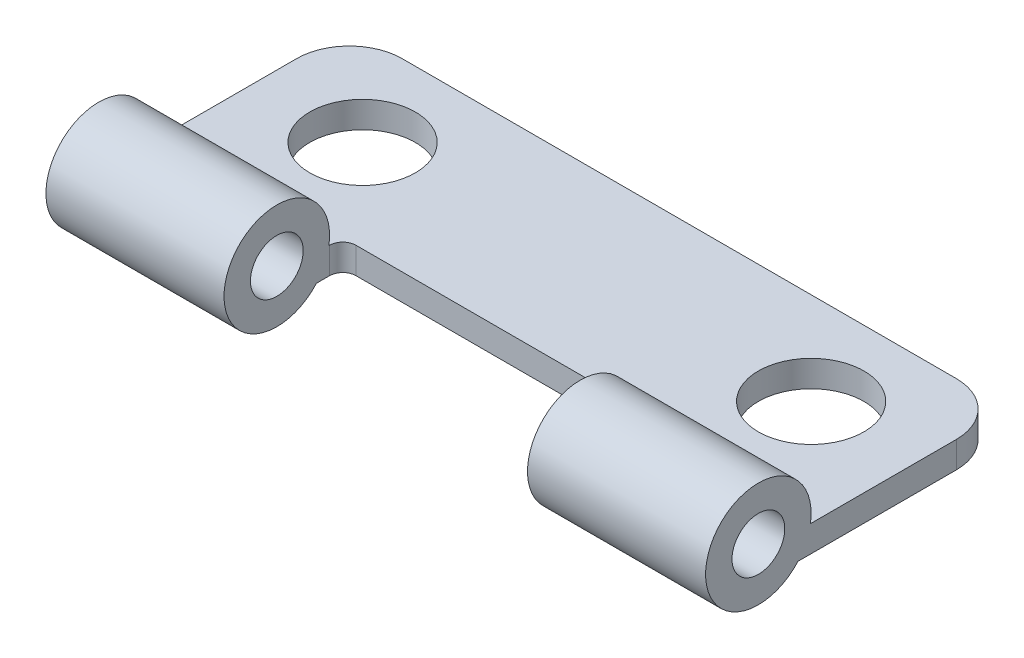
ISO-10303-21;
HEADER;
FILE_DESCRIPTION(('STEP AP214'),'2;1');
FILE_NAME('part.step','',(''),(''),'','','');
FILE_SCHEMA(('AUTOMOTIVE_DESIGN { 1 0 10303 214 1 1 1 1 }'));
ENDSEC;
DATA;
#1=APPLICATION_CONTEXT('core data for automotive mechanical design processes');
#2=APPLICATION_PROTOCOL_DEFINITION('international standard','automotive_design',2000,#1);
#3=PRODUCT_CONTEXT('',#1,'mechanical');
#4=PRODUCT('Part','Part','',(#3));
#5=PRODUCT_RELATED_PRODUCT_CATEGORY('part','',(#4));
#6=PRODUCT_DEFINITION_FORMATION('','',#4);
#7=PRODUCT_DEFINITION_CONTEXT('part definition',#1,'design');
#8=PRODUCT_DEFINITION('design','',#6,#7);
#9=PRODUCT_DEFINITION_SHAPE('','',#8);
#10=(LENGTH_UNIT() NAMED_UNIT(*) SI_UNIT(.MILLI.,.METRE.));
#11=(NAMED_UNIT(*) PLANE_ANGLE_UNIT() SI_UNIT($,.RADIAN.));
#12=(NAMED_UNIT(*) SI_UNIT($,.STERADIAN.) SOLID_ANGLE_UNIT());
#13=UNCERTAINTY_MEASURE_WITH_UNIT(LENGTH_MEASURE(1.E-05),#10,'distance_accuracy_value','');
#14=(GEOMETRIC_REPRESENTATION_CONTEXT(3) GLOBAL_UNCERTAINTY_ASSIGNED_CONTEXT((#13)) GLOBAL_UNIT_ASSIGNED_CONTEXT((#10,
#11,#12)) REPRESENTATION_CONTEXT('',''));
#15=CARTESIAN_POINT('',(0.,0.,0.));
#16=DIRECTION('',(0.,0.,1.));
#17=DIRECTION('',(1.,0.,0.));
#18=AXIS2_PLACEMENT_3D('',#15,#16,#17);
#19=CARTESIAN_POINT('',(0.,1.,0.));
#20=DIRECTION('',(0.,1.,0.));
#21=DIRECTION('',(0.,0.,1.));
#22=AXIS2_PLACEMENT_3D('',#19,#20,#21);
#23=PLANE('',#22);
#24=CARTESIAN_POINT('',(-8.5,1.,-4.5));
#25=DIRECTION('',(0.,1.,0.));
#26=DIRECTION('',(0.,0.,1.));
#27=AXIS2_PLACEMENT_3D('',#24,#25,#26);
#28=CIRCLE('',#27,2.);
#29=CARTESIAN_POINT('',(-8.5,1.,-2.5));
#30=VERTEX_POINT('',#29);
#31=EDGE_CURVE('E178',#30,#30,#28,.T.);
#32=ORIENTED_EDGE('',*,*,#31,.F.);
#33=EDGE_LOOP('',(#32));
#34=FACE_BOUND('',#33,.T.);
#35=CARTESIAN_POINT('',(8.5,1.,-4.5));
#36=DIRECTION('',(0.,1.,0.));
#37=DIRECTION('',(0.,0.,1.));
#38=AXIS2_PLACEMENT_3D('',#35,#36,#37);
#39=CIRCLE('',#38,2.);
#40=CARTESIAN_POINT('',(8.5,1.,-2.5));
#41=VERTEX_POINT('',#40);
#42=EDGE_CURVE('E276',#41,#41,#39,.T.);
#43=ORIENTED_EDGE('',*,*,#42,.F.);
#44=EDGE_LOOP('',(#43));
#45=FACE_BOUND('',#44,.T.);
#46=DIRECTION('',(0.,0.,1.));
#47=VECTOR('',#46,1.);
#48=CARTESIAN_POINT('',(5.75,1.,-1.));
#49=LINE('',#48,#47);
#50=CARTESIAN_POINT('',(5.75,1.,-0.5));
#51=VERTEX_POINT('',#50);
#52=CARTESIAN_POINT('',(5.75,1.,-0.473765769047734));
#53=VERTEX_POINT('',#52);
#54=EDGE_CURVE('E147',#51,#53,#49,.T.);
#55=ORIENTED_EDGE('',*,*,#54,.T.);
#56=DIRECTION('',(-1.,0.,0.));
#57=VECTOR('',#56,1.);
#58=CARTESIAN_POINT('',(18.1568542494924,1.,-0.473765769047734));
#59=LINE('',#58,#57);
#60=CARTESIAN_POINT('',(12.5,1.,-0.473765769047734));
#61=VERTEX_POINT('',#60);
#62=EDGE_CURVE('E134',#53,#61,#59,.F.);
#63=ORIENTED_EDGE('',*,*,#62,.T.);
#64=DIRECTION('',(0.,0.,-1.));
#65=VECTOR('',#64,1.);
#66=CARTESIAN_POINT('',(12.5,1.,0.));
#67=LINE('',#66,#65);
#68=CARTESIAN_POINT('',(12.5,1.,-6.));
#69=VERTEX_POINT('',#68);
#70=EDGE_CURVE('E150',#61,#69,#67,.T.);
#71=ORIENTED_EDGE('',*,*,#70,.T.);
#72=CARTESIAN_POINT('',(10.5,1.,-6.));
#73=DIRECTION('',(0.,1.,0.));
#74=DIRECTION('',(0.,0.,1.));
#75=AXIS2_PLACEMENT_3D('',#72,#73,#74);
#76=CIRCLE('',#75,2.);
#77=CARTESIAN_POINT('',(10.5,1.,-8.));
#78=VERTEX_POINT('',#77);
#79=EDGE_CURVE('E222',#69,#78,#76,.T.);
#80=ORIENTED_EDGE('',*,*,#79,.T.);
#81=DIRECTION('',(-1.,0.,0.));
#82=VECTOR('',#81,1.);
#83=CARTESIAN_POINT('',(-12.5,1.,-8.));
#84=LINE('',#83,#82);
#85=CARTESIAN_POINT('',(-10.5,1.,-8.));
#86=VERTEX_POINT('',#85);
#87=EDGE_CURVE('E161',#78,#86,#84,.T.);
#88=ORIENTED_EDGE('',*,*,#87,.T.);
#89=CARTESIAN_POINT('',(-10.5,1.,-6.));
#90=DIRECTION('',(0.,1.,0.));
#91=DIRECTION('',(0.,0.,1.));
#92=AXIS2_PLACEMENT_3D('',#89,#90,#91);
#93=CIRCLE('',#92,2.);
#94=CARTESIAN_POINT('',(-12.5,1.,-6.));
#95=VERTEX_POINT('',#94);
#96=EDGE_CURVE('E221',#86,#95,#93,.T.);
#97=ORIENTED_EDGE('',*,*,#96,.T.);
#98=DIRECTION('',(0.,0.,1.));
#99=VECTOR('',#98,1.);
#100=CARTESIAN_POINT('',(-12.5,1.,-1.));
#101=LINE('',#100,#99);
#102=CARTESIAN_POINT('',(-12.5,1.,-0.473765769047734));
#103=VERTEX_POINT('',#102);
#104=EDGE_CURVE('E66',#95,#103,#101,.T.);
#105=ORIENTED_EDGE('',*,*,#104,.T.);
#106=DIRECTION('',(1.,0.,0.));
#107=VECTOR('',#106,1.);
#108=CARTESIAN_POINT('',(-18.1568542494924,1.,-0.473765769047734));
#109=LINE('',#108,#107);
#110=CARTESIAN_POINT('',(-5.75,1.,-0.473765769047734));
#111=VERTEX_POINT('',#110);
#112=EDGE_CURVE('E63',#103,#111,#109,.T.);
#113=ORIENTED_EDGE('',*,*,#112,.T.);
#114=DIRECTION('',(0.,0.,-1.));
#115=VECTOR('',#114,1.);
#116=CARTESIAN_POINT('',(-5.75,1.,0.));
#117=LINE('',#116,#115);
#118=CARTESIAN_POINT('',(-5.75,1.,-0.500000000000001));
#119=VERTEX_POINT('',#118);
#120=EDGE_CURVE('E204',#111,#119,#117,.T.);
#121=ORIENTED_EDGE('',*,*,#120,.T.);
#122=CARTESIAN_POINT('',(-5.25,1.,-0.500000000000001));
#123=DIRECTION('',(0.,1.,0.));
#124=DIRECTION('',(0.,0.,1.));
#125=AXIS2_PLACEMENT_3D('',#122,#123,#124);
#126=CIRCLE('',#125,0.5);
#127=CARTESIAN_POINT('',(-5.25,1.,-1.));
#128=VERTEX_POINT('',#127);
#129=EDGE_CURVE('E11',#119,#128,#126,.F.);
#130=ORIENTED_EDGE('',*,*,#129,.T.);
#131=DIRECTION('',(1.,0.,0.));
#132=VECTOR('',#131,1.);
#133=CARTESIAN_POINT('',(-5.75,1.,-1.));
#134=LINE('',#133,#132);
#135=CARTESIAN_POINT('',(5.25,1.,-1.));
#136=VERTEX_POINT('',#135);
#137=EDGE_CURVE('E170',#128,#136,#134,.T.);
#138=ORIENTED_EDGE('',*,*,#137,.T.);
#139=CARTESIAN_POINT('',(5.25,1.,-0.5));
#140=DIRECTION('',(0.,1.,0.));
#141=DIRECTION('',(0.,0.,1.));
#142=AXIS2_PLACEMENT_3D('',#139,#140,#141);
#143=CIRCLE('',#142,0.5);
#144=EDGE_CURVE('E247',#136,#51,#143,.F.);
#145=ORIENTED_EDGE('',*,*,#144,.T.);
#146=EDGE_LOOP('',(#55,#63,#71,#80,#88,#97,#105,#113,#121,#130,#138,#145));
#147=FACE_BOUND('',#146,.T.);
#148=ADVANCED_FACE('F44',(#34,#45,#147),#23,.T.);
#149=CARTESIAN_POINT('',(0.,0.,0.));
#150=DIRECTION('',(0.,1.,0.));
#151=DIRECTION('',(0.,0.,1.));
#152=AXIS2_PLACEMENT_3D('',#149,#150,#151);
#153=PLANE('',#152);
#154=DIRECTION('',(0.,0.,1.));
#155=VECTOR('',#154,1.);
#156=CARTESIAN_POINT('',(-12.5,0.,-1.));
#157=LINE('',#156,#155);
#158=CARTESIAN_POINT('',(-12.5,0.,-6.));
#159=VERTEX_POINT('',#158);
#160=CARTESIAN_POINT('',(-12.5,0.,0.));
#161=VERTEX_POINT('',#160);
#162=EDGE_CURVE('E199',#159,#161,#157,.T.);
#163=ORIENTED_EDGE('',*,*,#162,.F.);
#164=CARTESIAN_POINT('',(-10.5,0.,-6.));
#165=DIRECTION('',(0.,1.,0.));
#166=DIRECTION('',(0.,0.,1.));
#167=AXIS2_PLACEMENT_3D('',#164,#165,#166);
#168=CIRCLE('',#167,2.);
#169=CARTESIAN_POINT('',(-10.5,0.,-8.));
#170=VERTEX_POINT('',#169);
#171=EDGE_CURVE('E211',#159,#170,#168,.F.);
#172=ORIENTED_EDGE('',*,*,#171,.T.);
#173=DIRECTION('',(-1.,0.,0.));
#174=VECTOR('',#173,1.);
#175=CARTESIAN_POINT('',(-12.5,0.,-8.));
#176=LINE('',#175,#174);
#177=CARTESIAN_POINT('',(10.5,0.,-8.));
#178=VERTEX_POINT('',#177);
#179=EDGE_CURVE('E198',#178,#170,#176,.T.);
#180=ORIENTED_EDGE('',*,*,#179,.F.);
#181=CARTESIAN_POINT('',(10.5,0.,-6.));
#182=DIRECTION('',(0.,1.,0.));
#183=DIRECTION('',(0.,0.,1.));
#184=AXIS2_PLACEMENT_3D('',#181,#182,#183);
#185=CIRCLE('',#184,2.);
#186=CARTESIAN_POINT('',(12.5,0.,-6.));
#187=VERTEX_POINT('',#186);
#188=EDGE_CURVE('E208',#178,#187,#185,.F.);
#189=ORIENTED_EDGE('',*,*,#188,.T.);
#190=DIRECTION('',(0.,0.,-1.));
#191=VECTOR('',#190,1.);
#192=CARTESIAN_POINT('',(12.5,0.,-8.));
#193=LINE('',#192,#191);
#194=CARTESIAN_POINT('',(12.5,0.,0.));
#195=VERTEX_POINT('',#194);
#196=EDGE_CURVE('E194',#195,#187,#193,.T.);
#197=ORIENTED_EDGE('',*,*,#196,.F.);
#198=DIRECTION('',(1.,0.,0.));
#199=VECTOR('',#198,1.);
#200=CARTESIAN_POINT('',(5.75,0.,0.));
#201=LINE('',#200,#199);
#202=CARTESIAN_POINT('',(5.75,0.,0.));
#203=VERTEX_POINT('',#202);
#204=EDGE_CURVE('E137',#203,#195,#201,.T.);
#205=ORIENTED_EDGE('',*,*,#204,.F.);
#206=DIRECTION('',(0.,0.,1.));
#207=VECTOR('',#206,1.);
#208=CARTESIAN_POINT('',(5.75,0.,-1.));
#209=LINE('',#208,#207);
#210=CARTESIAN_POINT('',(5.75,0.,-0.5));
#211=VERTEX_POINT('',#210);
#212=EDGE_CURVE('E190',#211,#203,#209,.T.);
#213=ORIENTED_EDGE('',*,*,#212,.F.);
#214=CARTESIAN_POINT('',(5.25,0.,-0.5));
#215=DIRECTION('',(0.,1.,0.));
#216=DIRECTION('',(0.,0.,1.));
#217=AXIS2_PLACEMENT_3D('',#214,#215,#216);
#218=CIRCLE('',#217,0.5);
#219=CARTESIAN_POINT('',(5.25,0.,-1.));
#220=VERTEX_POINT('',#219);
#221=EDGE_CURVE('E244',#211,#220,#218,.T.);
#222=ORIENTED_EDGE('',*,*,#221,.T.);
#223=DIRECTION('',(1.,0.,0.));
#224=VECTOR('',#223,1.);
#225=CARTESIAN_POINT('',(-5.75,0.,-1.));
#226=LINE('',#225,#224);
#227=CARTESIAN_POINT('',(-5.25,0.,-1.));
#228=VERTEX_POINT('',#227);
#229=EDGE_CURVE('E181',#228,#220,#226,.T.);
#230=ORIENTED_EDGE('',*,*,#229,.F.);
#231=CARTESIAN_POINT('',(-5.25,0.,-0.500000000000001));
#232=DIRECTION('',(0.,1.,0.));
#233=DIRECTION('',(0.,0.,1.));
#234=AXIS2_PLACEMENT_3D('',#231,#232,#233);
#235=CIRCLE('',#234,0.5);
#236=CARTESIAN_POINT('',(-5.75,0.,-0.500000000000001));
#237=VERTEX_POINT('',#236);
#238=EDGE_CURVE('E53',#228,#237,#235,.T.);
#239=ORIENTED_EDGE('',*,*,#238,.T.);
#240=DIRECTION('',(0.,0.,-1.));
#241=VECTOR('',#240,1.);
#242=CARTESIAN_POINT('',(-5.75,0.,0.));
#243=LINE('',#242,#241);
#244=CARTESIAN_POINT('',(-5.75,0.,0.));
#245=VERTEX_POINT('',#244);
#246=EDGE_CURVE('E179',#245,#237,#243,.T.);
#247=ORIENTED_EDGE('',*,*,#246,.F.);
#248=DIRECTION('',(1.,0.,0.));
#249=VECTOR('',#248,1.);
#250=CARTESIAN_POINT('',(-12.5,0.,0.));
#251=LINE('',#250,#249);
#252=EDGE_CURVE('E174',#161,#245,#251,.T.);
#253=ORIENTED_EDGE('',*,*,#252,.F.);
#254=EDGE_LOOP('',(#163,#172,#180,#189,#197,#205,#213,#222,#230,#239,#247,#253));
#255=FACE_BOUND('',#254,.T.);
#256=CARTESIAN_POINT('',(-8.5,0.,-4.5));
#257=DIRECTION('',(0.,1.,0.));
#258=DIRECTION('',(0.,0.,1.));
#259=AXIS2_PLACEMENT_3D('',#256,#257,#258);
#260=CIRCLE('',#259,2.);
#261=CARTESIAN_POINT('',(-8.5,0.,-2.5));
#262=VERTEX_POINT('',#261);
#263=EDGE_CURVE('E274',#262,#262,#260,.T.);
#264=ORIENTED_EDGE('',*,*,#263,.T.);
#265=EDGE_LOOP('',(#264));
#266=FACE_BOUND('',#265,.T.);
#267=CARTESIAN_POINT('',(8.5,0.,-4.5));
#268=DIRECTION('',(0.,1.,0.));
#269=DIRECTION('',(0.,0.,1.));
#270=AXIS2_PLACEMENT_3D('',#267,#268,#269);
#271=CIRCLE('',#270,2.);
#272=CARTESIAN_POINT('',(8.5,0.,-2.5));
#273=VERTEX_POINT('',#272);
#274=EDGE_CURVE('E281',#273,#273,#271,.T.);
#275=ORIENTED_EDGE('',*,*,#274,.T.);
#276=EDGE_LOOP('',(#275));
#277=FACE_BOUND('',#276,.T.);
#278=ADVANCED_FACE('F251',(#255,#266,#277),#153,.F.);
#279=CARTESIAN_POINT('',(-5.75,1.,0.));
#280=DIRECTION('',(-1.,0.,0.));
#281=DIRECTION('',(0.,0.,1.));
#282=AXIS2_PLACEMENT_3D('',#279,#280,#281);
#283=PLANE('',#282);
#284=ORIENTED_EDGE('',*,*,#120,.F.);
#285=CARTESIAN_POINT('',(-5.75,1.3228756555323,1.5));
#286=DIRECTION('',(-1.,0.,0.));
#287=DIRECTION('',(0.,0.,1.));
#288=AXIS2_PLACEMENT_3D('',#285,#286,#287);
#289=CIRCLE('',#288,2.);
#290=EDGE_CURVE('E262',#245,#111,#289,.T.);
#291=ORIENTED_EDGE('',*,*,#290,.F.);
#292=ORIENTED_EDGE('',*,*,#246,.T.);
#293=DIRECTION('',(0.,-1.,0.));
#294=VECTOR('',#293,1.);
#295=CARTESIAN_POINT('',(-5.75,1.,-0.500000000000001));
#296=LINE('',#295,#294);
#297=EDGE_CURVE('E238',#237,#119,#296,.F.);
#298=ORIENTED_EDGE('',*,*,#297,.T.);
#299=EDGE_LOOP('',(#284,#291,#292,#298));
#300=FACE_BOUND('',#299,.T.);
#301=CARTESIAN_POINT('',(-5.75,1.3228756555323,1.5));
#302=DIRECTION('',(-1.,0.,0.));
#303=DIRECTION('',(0.,0.,1.));
#304=AXIS2_PLACEMENT_3D('',#301,#302,#303);
#305=CIRCLE('',#304,1.);
#306=CARTESIAN_POINT('',(-5.75,1.3228756555323,2.5));
#307=VERTEX_POINT('',#306);
#308=EDGE_CURVE('E155',#307,#307,#305,.T.);
#309=ORIENTED_EDGE('',*,*,#308,.T.);
#310=EDGE_LOOP('',(#309));
#311=FACE_BOUND('',#310,.T.);
#312=ADVANCED_FACE('F257',(#300,#311),#283,.F.);
#313=CARTESIAN_POINT('',(-5.75,1.,-1.));
#314=DIRECTION('',(0.,0.,-1.));
#315=DIRECTION('',(-1.,0.,0.));
#316=AXIS2_PLACEMENT_3D('',#313,#314,#315);
#317=PLANE('',#316);
#318=ORIENTED_EDGE('',*,*,#229,.T.);
#319=DIRECTION('',(0.,-1.,0.));
#320=VECTOR('',#319,1.);
#321=CARTESIAN_POINT('',(5.25,1.,-1.));
#322=LINE('',#321,#320);
#323=EDGE_CURVE('E240',#220,#136,#322,.F.);
#324=ORIENTED_EDGE('',*,*,#323,.T.);
#325=ORIENTED_EDGE('',*,*,#137,.F.);
#326=DIRECTION('',(0.,-1.,0.));
#327=VECTOR('',#326,1.);
#328=CARTESIAN_POINT('',(-5.25,0.,-1.));
#329=LINE('',#328,#327);
#330=EDGE_CURVE('E234',#128,#228,#329,.T.);
#331=ORIENTED_EDGE('',*,*,#330,.T.);
#332=EDGE_LOOP('',(#318,#324,#325,#331));
#333=FACE_BOUND('',#332,.T.);
#334=ADVANCED_FACE('F267',(#333),#317,.F.);
#335=CARTESIAN_POINT('',(5.75,1.,-1.));
#336=DIRECTION('',(1.,0.,0.));
#337=DIRECTION('',(0.,0.,-1.));
#338=AXIS2_PLACEMENT_3D('',#335,#336,#337);
#339=PLANE('',#338);
#340=CARTESIAN_POINT('',(5.75,1.3228756555323,1.5));
#341=DIRECTION('',(1.,0.,0.));
#342=DIRECTION('',(0.,0.,-1.));
#343=AXIS2_PLACEMENT_3D('',#340,#341,#342);
#344=CIRCLE('',#343,2.);
#345=EDGE_CURVE('E141',#53,#203,#344,.T.);
#346=ORIENTED_EDGE('',*,*,#345,.F.);
#347=ORIENTED_EDGE('',*,*,#54,.F.);
#348=DIRECTION('',(0.,-1.,0.));
#349=VECTOR('',#348,1.);
#350=CARTESIAN_POINT('',(5.75,0.,-0.5));
#351=LINE('',#350,#349);
#352=EDGE_CURVE('E229',#51,#211,#351,.T.);
#353=ORIENTED_EDGE('',*,*,#352,.T.);
#354=ORIENTED_EDGE('',*,*,#212,.T.);
#355=EDGE_LOOP('',(#346,#347,#353,#354));
#356=FACE_BOUND('',#355,.T.);
#357=CARTESIAN_POINT('',(5.75,1.3228756555323,1.5));
#358=DIRECTION('',(1.,0.,0.));
#359=DIRECTION('',(0.,0.,-1.));
#360=AXIS2_PLACEMENT_3D('',#357,#358,#359);
#361=CIRCLE('',#360,1.);
#362=CARTESIAN_POINT('',(5.75,1.3228756555323,0.499999999999999));
#363=VERTEX_POINT('',#362);
#364=EDGE_CURVE('E145',#363,#363,#361,.T.);
#365=ORIENTED_EDGE('',*,*,#364,.T.);
#366=EDGE_LOOP('',(#365));
#367=FACE_BOUND('',#366,.T.);
#368=ADVANCED_FACE('F314',(#356,#367),#339,.F.);
#369=CARTESIAN_POINT('',(12.5,1.,-8.));
#370=DIRECTION('',(-1.,0.,0.));
#371=DIRECTION('',(0.,0.,1.));
#372=AXIS2_PLACEMENT_3D('',#369,#370,#371);
#373=PLANE('',#372);
#374=ORIENTED_EDGE('',*,*,#70,.F.);
#375=CARTESIAN_POINT('',(12.5,1.3228756555323,1.5));
#376=DIRECTION('',(-1.,0.,0.));
#377=DIRECTION('',(0.,0.,1.));
#378=AXIS2_PLACEMENT_3D('',#375,#376,#377);
#379=CIRCLE('',#378,2.);
#380=EDGE_CURVE('E133',#195,#61,#379,.T.);
#381=ORIENTED_EDGE('',*,*,#380,.F.);
#382=ORIENTED_EDGE('',*,*,#196,.T.);
#383=DIRECTION('',(0.,-1.,0.));
#384=VECTOR('',#383,1.);
#385=CARTESIAN_POINT('',(12.5,1.,-6.));
#386=LINE('',#385,#384);
#387=EDGE_CURVE('E158',#187,#69,#386,.F.);
#388=ORIENTED_EDGE('',*,*,#387,.T.);
#389=EDGE_LOOP('',(#374,#381,#382,#388));
#390=FACE_BOUND('',#389,.T.);
#391=CARTESIAN_POINT('',(12.5,1.3228756555323,1.5));
#392=DIRECTION('',(-1.,0.,0.));
#393=DIRECTION('',(0.,0.,1.));
#394=AXIS2_PLACEMENT_3D('',#391,#392,#393);
#395=CIRCLE('',#394,1.);
#396=CARTESIAN_POINT('',(12.5,1.3228756555323,2.5));
#397=VERTEX_POINT('',#396);
#398=EDGE_CURVE('E153',#397,#397,#395,.T.);
#399=ORIENTED_EDGE('',*,*,#398,.T.);
#400=EDGE_LOOP('',(#399));
#401=FACE_BOUND('',#400,.T.);
#402=ADVANCED_FACE('F154',(#390,#401),#373,.F.);
#403=CARTESIAN_POINT('',(-12.5,1.,-8.));
#404=DIRECTION('',(0.,0.,1.));
#405=DIRECTION('',(1.,0.,0.));
#406=AXIS2_PLACEMENT_3D('',#403,#404,#405);
#407=PLANE('',#406);
#408=ORIENTED_EDGE('',*,*,#179,.T.);
#409=DIRECTION('',(0.,-1.,0.));
#410=VECTOR('',#409,1.);
#411=CARTESIAN_POINT('',(-10.5,1.,-8.));
#412=LINE('',#411,#410);
#413=EDGE_CURVE('E217',#170,#86,#412,.F.);
#414=ORIENTED_EDGE('',*,*,#413,.T.);
#415=ORIENTED_EDGE('',*,*,#87,.F.);
#416=DIRECTION('',(0.,-1.,0.));
#417=VECTOR('',#416,1.);
#418=CARTESIAN_POINT('',(10.5,1.,-8.));
#419=LINE('',#418,#417);
#420=EDGE_CURVE('E212',#78,#178,#419,.T.);
#421=ORIENTED_EDGE('',*,*,#420,.T.);
#422=EDGE_LOOP('',(#408,#414,#415,#421));
#423=FACE_BOUND('',#422,.T.);
#424=ADVANCED_FACE('F322',(#423),#407,.F.);
#425=CARTESIAN_POINT('',(-12.5,1.,-1.));
#426=DIRECTION('',(1.,0.,0.));
#427=DIRECTION('',(0.,0.,-1.));
#428=AXIS2_PLACEMENT_3D('',#425,#426,#427);
#429=PLANE('',#428);
#430=ORIENTED_EDGE('',*,*,#162,.T.);
#431=CARTESIAN_POINT('',(-12.5,1.3228756555323,1.5));
#432=DIRECTION('',(1.,0.,0.));
#433=DIRECTION('',(0.,0.,-1.));
#434=AXIS2_PLACEMENT_3D('',#431,#432,#433);
#435=CIRCLE('',#434,2.);
#436=EDGE_CURVE('E298',#103,#161,#435,.T.);
#437=ORIENTED_EDGE('',*,*,#436,.F.);
#438=ORIENTED_EDGE('',*,*,#104,.F.);
#439=DIRECTION('',(0.,-1.,0.));
#440=VECTOR('',#439,1.);
#441=CARTESIAN_POINT('',(-12.5,1.,-6.));
#442=LINE('',#441,#440);
#443=EDGE_CURVE('E171',#95,#159,#442,.T.);
#444=ORIENTED_EDGE('',*,*,#443,.T.);
#445=EDGE_LOOP('',(#430,#437,#438,#444));
#446=FACE_BOUND('',#445,.T.);
#447=CARTESIAN_POINT('',(-12.5,1.3228756555323,1.5));
#448=DIRECTION('',(1.,0.,0.));
#449=DIRECTION('',(0.,0.,-1.));
#450=AXIS2_PLACEMENT_3D('',#447,#448,#449);
#451=CIRCLE('',#450,1.);
#452=CARTESIAN_POINT('',(-12.5,1.3228756555323,0.499999999999999));
#453=VERTEX_POINT('',#452);
#454=EDGE_CURVE('E295',#453,#453,#451,.T.);
#455=ORIENTED_EDGE('',*,*,#454,.T.);
#456=EDGE_LOOP('',(#455));
#457=FACE_BOUND('',#456,.T.);
#458=ADVANCED_FACE('F332',(#446,#457),#429,.F.);
#459=CARTESIAN_POINT('',(-8.5,1.,-4.5));
#460=DIRECTION('',(0.,-1.,0.));
#461=DIRECTION('',(0.,0.,-1.));
#462=AXIS2_PLACEMENT_3D('',#459,#460,#461);
#463=CYLINDRICAL_SURFACE('',#462,2.);
#464=ORIENTED_EDGE('',*,*,#31,.T.);
#465=EDGE_LOOP('',(#464));
#466=FACE_BOUND('',#465,.T.);
#467=ORIENTED_EDGE('',*,*,#263,.F.);
#468=EDGE_LOOP('',(#467));
#469=FACE_BOUND('',#468,.T.);
#470=ADVANCED_FACE('F357',(#466,#469),#463,.F.);
#471=CARTESIAN_POINT('',(8.5,1.,-4.5));
#472=DIRECTION('',(0.,-1.,0.));
#473=DIRECTION('',(0.,0.,-1.));
#474=AXIS2_PLACEMENT_3D('',#471,#472,#473);
#475=CYLINDRICAL_SURFACE('',#474,2.);
#476=ORIENTED_EDGE('',*,*,#42,.T.);
#477=EDGE_LOOP('',(#476));
#478=FACE_BOUND('',#477,.T.);
#479=ORIENTED_EDGE('',*,*,#274,.F.);
#480=EDGE_LOOP('',(#479));
#481=FACE_BOUND('',#480,.T.);
#482=ADVANCED_FACE('F373',(#478,#481),#475,.F.);
#483=CARTESIAN_POINT('',(-10.5,1.,-6.));
#484=DIRECTION('',(0.,-1.,0.));
#485=DIRECTION('',(0.,0.,-1.));
#486=AXIS2_PLACEMENT_3D('',#483,#484,#485);
#487=CYLINDRICAL_SURFACE('',#486,2.);
#488=ORIENTED_EDGE('',*,*,#96,.F.);
#489=ORIENTED_EDGE('',*,*,#413,.F.);
#490=ORIENTED_EDGE('',*,*,#171,.F.);
#491=ORIENTED_EDGE('',*,*,#443,.F.);
#492=EDGE_LOOP('',(#488,#489,#490,#491));
#493=FACE_BOUND('',#492,.T.);
#494=ADVANCED_FACE('F330',(#493),#487,.T.);
#495=CARTESIAN_POINT('',(10.5,1.,-6.));
#496=DIRECTION('',(0.,-1.,0.));
#497=DIRECTION('',(0.,0.,-1.));
#498=AXIS2_PLACEMENT_3D('',#495,#496,#497);
#499=CYLINDRICAL_SURFACE('',#498,2.);
#500=ORIENTED_EDGE('',*,*,#79,.F.);
#501=ORIENTED_EDGE('',*,*,#387,.F.);
#502=ORIENTED_EDGE('',*,*,#188,.F.);
#503=ORIENTED_EDGE('',*,*,#420,.F.);
#504=EDGE_LOOP('',(#500,#501,#502,#503));
#505=FACE_BOUND('',#504,.T.);
#506=ADVANCED_FACE('F317',(#505),#499,.T.);
#507=CARTESIAN_POINT('',(5.25,1.,-0.5));
#508=DIRECTION('',(0.,1.,0.));
#509=DIRECTION('',(0.,0.,1.));
#510=AXIS2_PLACEMENT_3D('',#507,#508,#509);
#511=CYLINDRICAL_SURFACE('',#510,0.5);
#512=ORIENTED_EDGE('',*,*,#144,.F.);
#513=ORIENTED_EDGE('',*,*,#323,.F.);
#514=ORIENTED_EDGE('',*,*,#221,.F.);
#515=ORIENTED_EDGE('',*,*,#352,.F.);
#516=EDGE_LOOP('',(#512,#513,#514,#515));
#517=FACE_BOUND('',#516,.T.);
#518=ADVANCED_FACE('F345',(#517),#511,.F.);
#519=CARTESIAN_POINT('',(-5.25,1.,-0.500000000000001));
#520=DIRECTION('',(0.,1.,0.));
#521=DIRECTION('',(0.,0.,1.));
#522=AXIS2_PLACEMENT_3D('',#519,#520,#521);
#523=CYLINDRICAL_SURFACE('',#522,0.5);
#524=ORIENTED_EDGE('',*,*,#129,.F.);
#525=ORIENTED_EDGE('',*,*,#297,.F.);
#526=ORIENTED_EDGE('',*,*,#238,.F.);
#527=ORIENTED_EDGE('',*,*,#330,.F.);
#528=EDGE_LOOP('',(#524,#525,#526,#527));
#529=FACE_BOUND('',#528,.T.);
#530=ADVANCED_FACE('F50',(#529),#523,.F.);
#531=CARTESIAN_POINT('',(-18.1568542494924,1.3228756555323,1.5));
#532=DIRECTION('',(1.,0.,0.));
#533=DIRECTION('',(0.,0.,-1.));
#534=AXIS2_PLACEMENT_3D('',#531,#532,#533);
#535=CYLINDRICAL_SURFACE('',#534,2.);
#536=ORIENTED_EDGE('',*,*,#112,.F.);
#537=ORIENTED_EDGE('',*,*,#436,.T.);
#538=ORIENTED_EDGE('',*,*,#252,.T.);
#539=ORIENTED_EDGE('',*,*,#290,.T.);
#540=EDGE_LOOP('',(#536,#537,#538,#539));
#541=FACE_BOUND('',#540,.T.);
#542=ADVANCED_FACE('F331',(#541),#535,.T.);
#543=CARTESIAN_POINT('',(-18.1568542494924,1.3228756555323,1.5));
#544=DIRECTION('',(1.,0.,0.));
#545=DIRECTION('',(0.,0.,-1.));
#546=AXIS2_PLACEMENT_3D('',#543,#544,#545);
#547=CYLINDRICAL_SURFACE('',#546,1.);
#548=ORIENTED_EDGE('',*,*,#454,.F.);
#549=EDGE_LOOP('',(#548));
#550=FACE_BOUND('',#549,.T.);
#551=ORIENTED_EDGE('',*,*,#308,.F.);
#552=EDGE_LOOP('',(#551));
#553=FACE_BOUND('',#552,.T.);
#554=ADVANCED_FACE('F338',(#550,#553),#547,.F.);
#555=CARTESIAN_POINT('',(18.1568542494924,1.3228756555323,1.5));
#556=DIRECTION('',(-1.,0.,0.));
#557=DIRECTION('',(0.,0.,1.));
#558=AXIS2_PLACEMENT_3D('',#555,#556,#557);
#559=CYLINDRICAL_SURFACE('',#558,2.);
#560=ORIENTED_EDGE('',*,*,#62,.F.);
#561=ORIENTED_EDGE('',*,*,#345,.T.);
#562=ORIENTED_EDGE('',*,*,#204,.T.);
#563=ORIENTED_EDGE('',*,*,#380,.T.);
#564=EDGE_LOOP('',(#560,#561,#562,#563));
#565=FACE_BOUND('',#564,.T.);
#566=ADVANCED_FACE('F131',(#565),#559,.T.);
#567=CARTESIAN_POINT('',(18.1568542494924,1.3228756555323,1.5));
#568=DIRECTION('',(-1.,0.,0.));
#569=DIRECTION('',(0.,0.,1.));
#570=AXIS2_PLACEMENT_3D('',#567,#568,#569);
#571=CYLINDRICAL_SURFACE('',#570,1.);
#572=ORIENTED_EDGE('',*,*,#398,.F.);
#573=EDGE_LOOP('',(#572));
#574=FACE_BOUND('',#573,.T.);
#575=ORIENTED_EDGE('',*,*,#364,.F.);
#576=EDGE_LOOP('',(#575));
#577=FACE_BOUND('',#576,.T.);
#578=ADVANCED_FACE('F442',(#574,#577),#571,.F.);
#579=CLOSED_SHELL('',(#148,#278,#312,#334,#368,#402,#424,#458,#470,#482,#494,#506,#518,#530,
#542,#554,#566,#578));
#580=MANIFOLD_SOLID_BREP('B2',#579);
#581=ADVANCED_BREP_SHAPE_REPRESENTATION('',(#18,#580),#14);
#582=SHAPE_DEFINITION_REPRESENTATION(#9,#581);
ENDSEC;
END-ISO-10303-21;
